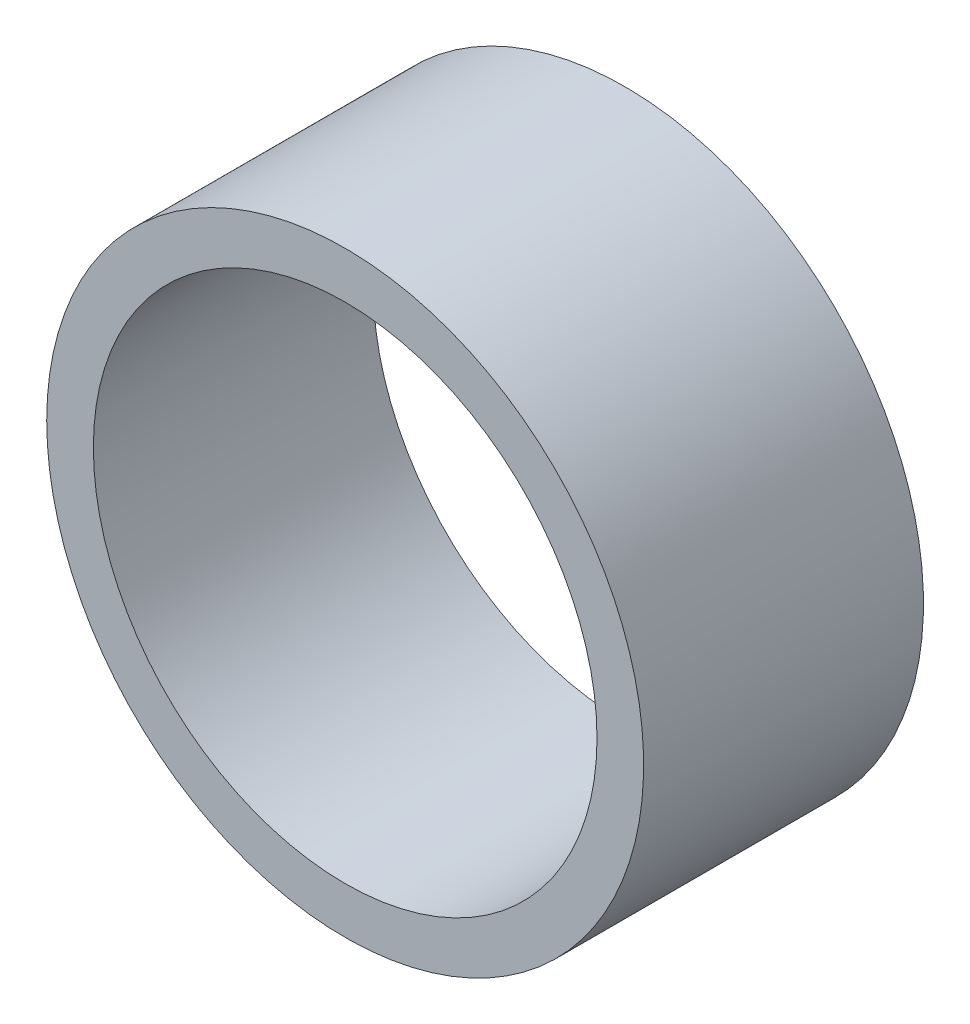
ISO-10303-21;
HEADER;
FILE_DESCRIPTION(('STEP AP214'),'2;1');
FILE_NAME('part.step','',(''),(''),'','','');
FILE_SCHEMA(('AUTOMOTIVE_DESIGN { 1 0 10303 214 1 1 1 1 }'));
ENDSEC;
DATA;
#1=APPLICATION_CONTEXT('core data for automotive mechanical design processes');
#2=APPLICATION_PROTOCOL_DEFINITION('international standard','automotive_design',2000,#1);
#3=PRODUCT_CONTEXT('',#1,'mechanical');
#4=PRODUCT('Part','Part','',(#3));
#5=PRODUCT_RELATED_PRODUCT_CATEGORY('part','',(#4));
#6=PRODUCT_DEFINITION_FORMATION('','',#4);
#7=PRODUCT_DEFINITION_CONTEXT('part definition',#1,'design');
#8=PRODUCT_DEFINITION('design','',#6,#7);
#9=PRODUCT_DEFINITION_SHAPE('','',#8);
#10=(LENGTH_UNIT() NAMED_UNIT(*) SI_UNIT(.MILLI.,.METRE.));
#11=(NAMED_UNIT(*) PLANE_ANGLE_UNIT() SI_UNIT($,.RADIAN.));
#12=(NAMED_UNIT(*) SI_UNIT($,.STERADIAN.) SOLID_ANGLE_UNIT());
#13=UNCERTAINTY_MEASURE_WITH_UNIT(LENGTH_MEASURE(1.E-05),#10,'distance_accuracy_value','');
#14=(GEOMETRIC_REPRESENTATION_CONTEXT(3) GLOBAL_UNCERTAINTY_ASSIGNED_CONTEXT((#13)) GLOBAL_UNIT_ASSIGNED_CONTEXT((#10,
#11,#12)) REPRESENTATION_CONTEXT('',''));
#15=CARTESIAN_POINT('',(0.,0.,0.));
#16=DIRECTION('',(0.,0.,1.));
#17=DIRECTION('',(1.,0.,0.));
#18=AXIS2_PLACEMENT_3D('',#15,#16,#17);
#19=CARTESIAN_POINT('',(1.38777878078145E-13,3.33066907387547E-13,3.));
#20=DIRECTION('',(0.,0.,0.999999999999981));
#21=DIRECTION('',(0.999999999999988,0.,0.));
#22=AXIS2_PLACEMENT_3D('',#19,#20,#21);
#23=PLANE('',#22);
#24=CARTESIAN_POINT('',(1.38777878078145E-13,3.33066907387547E-13,3.));
#25=DIRECTION('',(0.,0.,0.999999999999981));
#26=DIRECTION('',(0.999999999999988,0.,0.));
#27=AXIS2_PLACEMENT_3D('',#24,#25,#26);
#28=CIRCLE('',#27,3.2);
#29=CARTESIAN_POINT('',(-3.19999999999982,3.19921866775985E-13,3.));
#30=VERTEX_POINT('',#29);
#31=EDGE_CURVE('E10',#30,#30,#28,.T.);
#32=ORIENTED_EDGE('',*,*,#31,.T.);
#33=EDGE_LOOP('',(#32));
#34=FACE_BOUND('',#33,.T.);
#35=CARTESIAN_POINT('',(1.38777878078145E-13,3.33066907387547E-13,3.));
#36=DIRECTION('',(0.,0.,0.999999999999981));
#37=DIRECTION('',(0.999999999999988,0.,0.));
#38=AXIS2_PLACEMENT_3D('',#35,#36,#37);
#39=CIRCLE('',#38,2.7);
#40=CARTESIAN_POINT('',(-2.69999999999983,3.21975779371542E-13,3.));
#41=VERTEX_POINT('',#40);
#42=EDGE_CURVE('E48',#41,#41,#39,.T.);
#43=ORIENTED_EDGE('',*,*,#42,.F.);
#44=EDGE_LOOP('',(#43));
#45=FACE_BOUND('',#44,.T.);
#46=ADVANCED_FACE('F37',(#34,#45),#23,.T.);
#47=CARTESIAN_POINT('',(0.,0.,0.));
#48=DIRECTION('',(0.,0.,0.999999999999981));
#49=DIRECTION('',(0.999999999999988,0.,0.));
#50=AXIS2_PLACEMENT_3D('',#47,#48,#49);
#51=PLANE('',#50);
#52=CARTESIAN_POINT('',(0.,0.,0.));
#53=DIRECTION('',(0.,0.,0.999999999999981));
#54=DIRECTION('',(0.999999999999988,0.,0.));
#55=AXIS2_PLACEMENT_3D('',#52,#53,#54);
#56=CIRCLE('',#55,3.2);
#57=CARTESIAN_POINT('',(-3.19999999999982,3.16190249301783E-13,0.));
#58=VERTEX_POINT('',#57);
#59=EDGE_CURVE('E41',#58,#58,#56,.T.);
#60=ORIENTED_EDGE('',*,*,#59,.F.);
#61=EDGE_LOOP('',(#60));
#62=FACE_BOUND('',#61,.T.);
#63=CARTESIAN_POINT('',(0.,0.,0.));
#64=DIRECTION('',(0.,0.,0.999999999999981));
#65=DIRECTION('',(0.999999999999988,0.,0.));
#66=AXIS2_PLACEMENT_3D('',#63,#64,#65);
#67=CIRCLE('',#66,2.7);
#68=CARTESIAN_POINT('',(-2.69999999999982,3.18244161897339E-13,0.));
#69=VERTEX_POINT('',#68);
#70=EDGE_CURVE('E50',#69,#69,#67,.T.);
#71=ORIENTED_EDGE('',*,*,#70,.T.);
#72=EDGE_LOOP('',(#71));
#73=FACE_BOUND('',#72,.T.);
#74=ADVANCED_FACE('F60',(#62,#73),#51,.F.);
#75=CARTESIAN_POINT('',(1.38777878078145E-13,3.33066907387547E-13,3.));
#76=DIRECTION('',(0.,0.,-0.999999999999981));
#77=DIRECTION('',(-0.999999999999988,0.,0.));
#78=AXIS2_PLACEMENT_3D('',#75,#76,#77);
#79=CYLINDRICAL_SURFACE('',#78,3.2);
#80=CARTESIAN_POINT('',(-3.19999999999982,3.19921866775985E-13,3.));
#81=CARTESIAN_POINT('',(-3.19999999999982,3.19882995760629E-13,2.96875));
#82=CARTESIAN_POINT('',(-3.19999999999982,3.19844124745273E-13,2.9375));
#83=CARTESIAN_POINT('',(-3.19999999999982,3.1976638271456E-13,2.875));
#84=CARTESIAN_POINT('',(-3.19999999999982,3.19727511699204E-13,2.84375));
#85=CARTESIAN_POINT('',(-3.19999999999982,3.19649769668491E-13,2.78125));
#86=CARTESIAN_POINT('',(-3.19999999999982,3.19610898653135E-13,2.75));
#87=CARTESIAN_POINT('',(-3.19999999999982,3.19533156622422E-13,2.6875));
#88=CARTESIAN_POINT('',(-3.19999999999982,3.19494285607066E-13,2.65625));
#89=CARTESIAN_POINT('',(-3.19999999999982,3.19416543576354E-13,2.59375));
#90=CARTESIAN_POINT('',(-3.19999999999982,3.19377672560997E-13,2.5625));
#91=CARTESIAN_POINT('',(-3.19999999999982,3.19299930530285E-13,2.49999999999999));
#92=CARTESIAN_POINT('',(-3.19999999999982,3.19261059514928E-13,2.46875));
#93=CARTESIAN_POINT('',(-3.19999999999982,3.19183317484216E-13,2.40625));
#94=CARTESIAN_POINT('',(-3.19999999999982,3.1914444646886E-13,2.375));
#95=CARTESIAN_POINT('',(-3.19999999999982,3.19066704438147E-13,2.3125));
#96=CARTESIAN_POINT('',(-3.19999999999982,3.19027833422791E-13,2.28125));
#97=CARTESIAN_POINT('',(-3.19999999999982,3.18950091392078E-13,2.21875));
#98=CARTESIAN_POINT('',(-3.19999999999982,3.18911220376722E-13,2.18749999999999));
#99=CARTESIAN_POINT('',(-3.19999999999982,3.18833478346009E-13,2.12499999999999));
#100=CARTESIAN_POINT('',(-3.19999999999982,3.18794607330653E-13,2.09374999999999));
#101=CARTESIAN_POINT('',(-3.19999999999982,3.18716865299941E-13,2.03124999999999));
#102=CARTESIAN_POINT('',(-3.19999999999982,3.18677994284584E-13,1.99999999999999));
#103=CARTESIAN_POINT('',(-3.19999999999982,3.18600252253872E-13,1.93749999999999));
#104=CARTESIAN_POINT('',(-3.19999999999982,3.18561381238516E-13,1.90624999999999));
#105=CARTESIAN_POINT('',(-3.19999999999982,3.18483639207803E-13,1.84374999999999));
#106=CARTESIAN_POINT('',(-3.19999999999982,3.18444768192447E-13,1.81249999999999));
#107=CARTESIAN_POINT('',(-3.19999999999982,3.18367026161734E-13,1.74999999999999));
#108=CARTESIAN_POINT('',(-3.19999999999982,3.18328155146378E-13,1.71874999999999));
#109=CARTESIAN_POINT('',(-3.19999999999982,3.18250413115665E-13,1.65624999999999));
#110=CARTESIAN_POINT('',(-3.19999999999982,3.18211542100309E-13,1.62499999999999));
#111=CARTESIAN_POINT('',(-3.19999999999982,3.18133800069597E-13,1.56249999999999));
#112=CARTESIAN_POINT('',(-3.19999999999982,3.1809492905424E-13,1.53124999999999));
#113=CARTESIAN_POINT('',(-3.19999999999982,3.18017187023528E-13,1.46874999999999));
#114=CARTESIAN_POINT('',(-3.19999999999982,3.17978316008171E-13,1.43749999999999));
#115=CARTESIAN_POINT('',(-3.19999999999982,3.17900573977459E-13,1.37499999999999));
#116=CARTESIAN_POINT('',(-3.19999999999982,3.17861702962103E-13,1.34374999999999));
#117=CARTESIAN_POINT('',(-3.19999999999982,3.1778396093139E-13,1.28124999999999));
#118=CARTESIAN_POINT('',(-3.19999999999982,3.17745089916034E-13,1.24999999999999));
#119=CARTESIAN_POINT('',(-3.19999999999982,3.17667347885321E-13,1.18749999999999));
#120=CARTESIAN_POINT('',(-3.19999999999982,3.17628476869965E-13,1.15624999999999));
#121=CARTESIAN_POINT('',(-3.19999999999982,3.17550734839252E-13,1.09374999999999));
#122=CARTESIAN_POINT('',(-3.19999999999982,3.17511863823896E-13,1.06249999999999));
#123=CARTESIAN_POINT('',(-3.19999999999982,3.17434121793184E-13,0.999999999999994));
#124=CARTESIAN_POINT('',(-3.19999999999982,3.17395250777827E-13,0.968749999999994));
#125=CARTESIAN_POINT('',(-3.19999999999982,3.17317508747115E-13,0.906249999999994));
#126=CARTESIAN_POINT('',(-3.19999999999982,3.17278637731759E-13,0.874999999999994));
#127=CARTESIAN_POINT('',(-3.19999999999982,3.17200895701046E-13,0.812499999999994));
#128=CARTESIAN_POINT('',(-3.19999999999982,3.1716202468569E-13,0.781249999999994));
#129=CARTESIAN_POINT('',(-3.19999999999982,3.17084282654977E-13,0.718749999999994));
#130=CARTESIAN_POINT('',(-3.19999999999982,3.17045411639621E-13,0.687499999999993));
#131=CARTESIAN_POINT('',(-3.19999999999982,3.16967669608908E-13,0.624999999999993));
#132=CARTESIAN_POINT('',(-3.19999999999982,3.16928798593552E-13,0.593749999999993));
#133=CARTESIAN_POINT('',(-3.19999999999982,3.1685105656284E-13,0.531249999999994));
#134=CARTESIAN_POINT('',(-3.19999999999982,3.16812185547483E-13,0.499999999999994));
#135=CARTESIAN_POINT('',(-3.19999999999982,3.16734443516771E-13,0.437499999999993));
#136=CARTESIAN_POINT('',(-3.19999999999982,3.16695572501414E-13,0.406249999999993));
#137=CARTESIAN_POINT('',(-3.19999999999982,3.16617830470702E-13,0.343749999999993));
#138=CARTESIAN_POINT('',(-3.19999999999982,3.16578959455346E-13,0.312499999999993));
#139=CARTESIAN_POINT('',(-3.19999999999982,3.16501217424633E-13,0.249999999999993));
#140=CARTESIAN_POINT('',(-3.19999999999982,3.16462346409277E-13,0.218749999999993));
#141=CARTESIAN_POINT('',(-3.19999999999982,3.16384604378564E-13,0.156249999999993));
#142=CARTESIAN_POINT('',(-3.19999999999982,3.16345733363208E-13,0.124999999999993));
#143=CARTESIAN_POINT('',(-3.19999999999982,3.16267991332495E-13,0.0624999999999928));
#144=CARTESIAN_POINT('',(-3.19999999999982,3.16229120317139E-13,0.0312499999999929));
#145=CARTESIAN_POINT('',(-3.19999999999982,3.16190249301783E-13,0.));
#146=B_SPLINE_CURVE_WITH_KNOTS('',3,(#80,#81,#82,#83,#84,#85,#86,#87,#88,#89,#90,#91,#92,#93,
#94,#95,#96,#97,#98,#99,#100,#101,#102,#103,#104,#105,#106,#107,#108,#109,#110,#111,#112,#113,
#114,#115,#116,#117,#118,#119,#120,#121,#122,#123,#124,#125,#126,#127,#128,#129,#130,#131,#132,
#133,#134,#135,#136,#137,#138,#139,#140,#141,#142,#143,#144,#145),.UNSPECIFIED.,.F.,.F.,(4,2,2,
2,2,2,2,2,2,2,2,2,2,2,2,2,2,2,2,2,2,2,2,2,2,2,2,2,2,2,2,2,4),(0.,0.0937500000000001,0.1875,
0.28125,0.375,0.468750000000001,0.5625,0.656250000000001,0.750000000000001,0.843750000000001,
0.937500000000001,1.03125,1.125,1.21875,1.3125,1.40625,1.5,1.59375,1.6875,1.78125,1.875,1.96875,
2.0625,2.15625,2.25,2.34375,2.4375,2.53125,2.625,2.71875,2.8125,2.90625,3.),.UNSPECIFIED.);
#147=EDGE_CURVE('BSEAM39',#30,#58,#146,.T.);
#148=ORIENTED_EDGE('',*,*,#31,.F.);
#149=ORIENTED_EDGE('',*,*,#59,.T.);
#150=ORIENTED_EDGE('',*,*,#147,.T.);
#151=ORIENTED_EDGE('',*,*,#147,.F.);
#152=EDGE_LOOP('',(#148,#150,#149,#151));
#153=FACE_BOUND('',#152,.T.);
#154=ADVANCED_FACE('F39',(#153),#79,.T.);
#155=CARTESIAN_POINT('',(1.38777878078145E-13,3.33066907387547E-13,3.));
#156=DIRECTION('',(0.,0.,-0.999999999999981));
#157=DIRECTION('',(-0.999999999999988,0.,0.));
#158=AXIS2_PLACEMENT_3D('',#155,#156,#157);
#159=CYLINDRICAL_SURFACE('',#158,2.7);
#160=CARTESIAN_POINT('',(-2.69999999999983,3.21975779371542E-13,3.));
#161=CARTESIAN_POINT('',(-2.69999999999983,3.21936908356185E-13,2.96875));
#162=CARTESIAN_POINT('',(-2.69999999999983,3.21898037340829E-13,2.9375));
#163=CARTESIAN_POINT('',(-2.69999999999983,3.21820295310117E-13,2.875));
#164=CARTESIAN_POINT('',(-2.69999999999983,3.2178142429476E-13,2.84375));
#165=CARTESIAN_POINT('',(-2.69999999999983,3.21703682264048E-13,2.78125));
#166=CARTESIAN_POINT('',(-2.69999999999983,3.21664811248691E-13,2.75));
#167=CARTESIAN_POINT('',(-2.69999999999983,3.21587069217979E-13,2.6875));
#168=CARTESIAN_POINT('',(-2.69999999999983,3.21548198202623E-13,2.65625));
#169=CARTESIAN_POINT('',(-2.69999999999983,3.2147045617191E-13,2.59375));
#170=CARTESIAN_POINT('',(-2.69999999999983,3.21431585156554E-13,2.5625));
#171=CARTESIAN_POINT('',(-2.69999999999983,3.21353843125841E-13,2.5));
#172=CARTESIAN_POINT('',(-2.69999999999983,3.21314972110485E-13,2.46875));
#173=CARTESIAN_POINT('',(-2.69999999999983,3.21237230079772E-13,2.40625));
#174=CARTESIAN_POINT('',(-2.69999999999983,3.21198359064416E-13,2.375));
#175=CARTESIAN_POINT('',(-2.69999999999983,3.21120617033704E-13,2.3125));
#176=CARTESIAN_POINT('',(-2.69999999999983,3.21081746018347E-13,2.28125));
#177=CARTESIAN_POINT('',(-2.69999999999983,3.21004003987635E-13,2.21875));
#178=CARTESIAN_POINT('',(-2.69999999999983,3.20965132972279E-13,2.1875));
#179=CARTESIAN_POINT('',(-2.69999999999983,3.20887390941566E-13,2.125));
#180=CARTESIAN_POINT('',(-2.69999999999983,3.2084851992621E-13,2.09375));
#181=CARTESIAN_POINT('',(-2.69999999999983,3.20770777895497E-13,2.03125));
#182=CARTESIAN_POINT('',(-2.69999999999983,3.20731906880141E-13,2.));
#183=CARTESIAN_POINT('',(-2.69999999999983,3.20654164849428E-13,1.9375));
#184=CARTESIAN_POINT('',(-2.69999999999983,3.20615293834072E-13,1.90625));
#185=CARTESIAN_POINT('',(-2.69999999999983,3.2053755180336E-13,1.84375));
#186=CARTESIAN_POINT('',(-2.69999999999983,3.20498680788003E-13,1.8125));
#187=CARTESIAN_POINT('',(-2.69999999999983,3.20420938757291E-13,1.75));
#188=CARTESIAN_POINT('',(-2.69999999999983,3.20382067741934E-13,1.71875));
#189=CARTESIAN_POINT('',(-2.69999999999983,3.20304325711222E-13,1.65625));
#190=CARTESIAN_POINT('',(-2.69999999999983,3.20265454695866E-13,1.625));
#191=CARTESIAN_POINT('',(-2.69999999999983,3.20187712665153E-13,1.5625));
#192=CARTESIAN_POINT('',(-2.69999999999983,3.20148841649797E-13,1.53125));
#193=CARTESIAN_POINT('',(-2.69999999999983,3.20071099619084E-13,1.46875));
#194=CARTESIAN_POINT('',(-2.69999999999983,3.20032228603728E-13,1.4375));
#195=CARTESIAN_POINT('',(-2.69999999999983,3.19954486573015E-13,1.375));
#196=CARTESIAN_POINT('',(-2.69999999999983,3.19915615557659E-13,1.34375));
#197=CARTESIAN_POINT('',(-2.69999999999983,3.19837873526947E-13,1.28125));
#198=CARTESIAN_POINT('',(-2.69999999999982,3.1979900251159E-13,1.25));
#199=CARTESIAN_POINT('',(-2.69999999999982,3.19721260480878E-13,1.1875));
#200=CARTESIAN_POINT('',(-2.69999999999982,3.19682389465522E-13,1.15624999999999));
#201=CARTESIAN_POINT('',(-2.69999999999982,3.19604647434809E-13,1.09374999999999));
#202=CARTESIAN_POINT('',(-2.69999999999982,3.19565776419453E-13,1.06249999999999));
#203=CARTESIAN_POINT('',(-2.69999999999982,3.1948803438874E-13,0.999999999999995));
#204=CARTESIAN_POINT('',(-2.69999999999982,3.19449163373384E-13,0.968749999999995));
#205=CARTESIAN_POINT('',(-2.69999999999982,3.19371421342671E-13,0.906249999999995));
#206=CARTESIAN_POINT('',(-2.69999999999982,3.19332550327315E-13,0.874999999999995));
#207=CARTESIAN_POINT('',(-2.69999999999982,3.19254808296603E-13,0.812499999999995));
#208=CARTESIAN_POINT('',(-2.69999999999982,3.19215937281246E-13,0.781249999999995));
#209=CARTESIAN_POINT('',(-2.69999999999982,3.19138195250534E-13,0.718749999999994));
#210=CARTESIAN_POINT('',(-2.69999999999982,3.19099324235178E-13,0.687499999999994));
#211=CARTESIAN_POINT('',(-2.69999999999982,3.19021582204465E-13,0.624999999999994));
#212=CARTESIAN_POINT('',(-2.69999999999982,3.18982711189109E-13,0.593749999999994));
#213=CARTESIAN_POINT('',(-2.69999999999982,3.18904969158396E-13,0.531249999999994));
#214=CARTESIAN_POINT('',(-2.69999999999982,3.1886609814304E-13,0.499999999999994));
#215=CARTESIAN_POINT('',(-2.69999999999982,3.18788356112327E-13,0.437499999999994));
#216=CARTESIAN_POINT('',(-2.69999999999982,3.18749485096971E-13,0.406249999999994));
#217=CARTESIAN_POINT('',(-2.69999999999982,3.18671743066258E-13,0.343749999999994));
#218=CARTESIAN_POINT('',(-2.69999999999982,3.18632872050902E-13,0.312499999999994));
#219=CARTESIAN_POINT('',(-2.69999999999982,3.1855513002019E-13,0.249999999999994));
#220=CARTESIAN_POINT('',(-2.69999999999982,3.18516259004833E-13,0.218749999999994));
#221=CARTESIAN_POINT('',(-2.69999999999982,3.18438516974121E-13,0.156249999999994));
#222=CARTESIAN_POINT('',(-2.69999999999982,3.18399645958765E-13,0.124999999999994));
#223=CARTESIAN_POINT('',(-2.69999999999982,3.18321903928052E-13,0.0624999999999937));
#224=CARTESIAN_POINT('',(-2.69999999999982,3.18283032912696E-13,0.0312499999999938));
#225=CARTESIAN_POINT('',(-2.69999999999982,3.18244161897339E-13,0.));
#226=B_SPLINE_CURVE_WITH_KNOTS('',3,(#160,#161,#162,#163,#164,#165,#166,#167,#168,#169,#170,
#171,#172,#173,#174,#175,#176,#177,#178,#179,#180,#181,#182,#183,#184,#185,#186,#187,#188,#189,
#190,#191,#192,#193,#194,#195,#196,#197,#198,#199,#200,#201,#202,#203,#204,#205,#206,#207,#208,
#209,#210,#211,#212,#213,#214,#215,#216,#217,#218,#219,#220,#221,#222,#223,#224,#225),
.UNSPECIFIED.,.F.,.F.,(4,2,2,2,2,2,2,2,2,2,2,2,2,2,2,2,2,2,2,2,2,2,2,2,2,2,2,2,2,2,2,2,4),(0.,
0.0937500000000001,0.1875,0.28125,0.375,0.46875,0.5625,0.656250000000001,0.750000000000001,
0.843750000000001,0.937500000000001,1.03125,1.125,1.21875,1.3125,1.40625,1.5,1.59375,1.6875,
1.78125,1.875,1.96875,2.0625,2.15625,2.25,2.34375,2.4375,2.53125,2.625,2.71875,2.8125,2.90625,
3.),.UNSPECIFIED.);
#227=EDGE_CURVE('BSEAM56',#41,#69,#226,.T.);
#228=ORIENTED_EDGE('',*,*,#42,.T.);
#229=ORIENTED_EDGE('',*,*,#70,.F.);
#230=ORIENTED_EDGE('',*,*,#227,.T.);
#231=ORIENTED_EDGE('',*,*,#227,.F.);
#232=EDGE_LOOP('',(#228,#230,#229,#231));
#233=FACE_BOUND('',#232,.T.);
#234=ADVANCED_FACE('F56',(#233),#159,.F.);
#235=CLOSED_SHELL('',(#46,#74,#154,#234));
#236=MANIFOLD_SOLID_BREP('B2',#235);
#237=ADVANCED_BREP_SHAPE_REPRESENTATION('',(#18,#236),#14);
#238=SHAPE_DEFINITION_REPRESENTATION(#9,#237);
ENDSEC;
END-ISO-10303-21;
